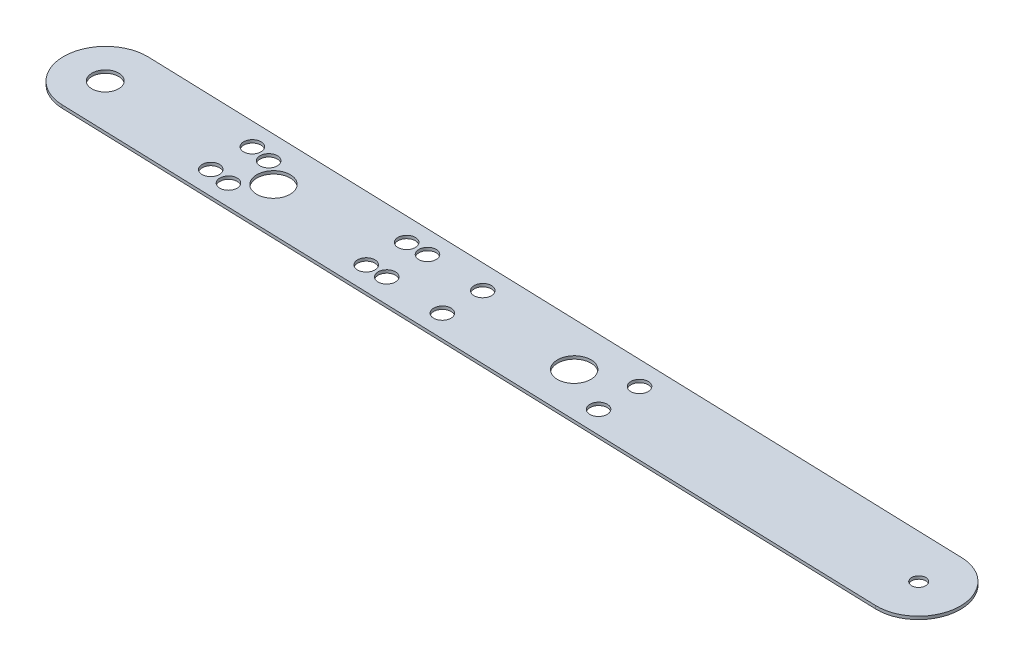
ISO-10303-21;
HEADER;
FILE_DESCRIPTION(('STEP AP214'),'2;1');
FILE_NAME('part.step','',(''),(''),'','','');
FILE_SCHEMA(('AUTOMOTIVE_DESIGN { 1 0 10303 214 1 1 1 1 }'));
ENDSEC;
DATA;
#1=APPLICATION_CONTEXT('core data for automotive mechanical design processes');
#2=APPLICATION_PROTOCOL_DEFINITION('international standard','automotive_design',2000,#1);
#3=PRODUCT_CONTEXT('',#1,'mechanical');
#4=PRODUCT('Part','Part','',(#3));
#5=PRODUCT_RELATED_PRODUCT_CATEGORY('part','',(#4));
#6=PRODUCT_DEFINITION_FORMATION('','',#4);
#7=PRODUCT_DEFINITION_CONTEXT('part definition',#1,'design');
#8=PRODUCT_DEFINITION('design','',#6,#7);
#9=PRODUCT_DEFINITION_SHAPE('','',#8);
#10=(LENGTH_UNIT() NAMED_UNIT(*) SI_UNIT(.MILLI.,.METRE.));
#11=(NAMED_UNIT(*) PLANE_ANGLE_UNIT() SI_UNIT($,.RADIAN.));
#12=(NAMED_UNIT(*) SI_UNIT($,.STERADIAN.) SOLID_ANGLE_UNIT());
#13=UNCERTAINTY_MEASURE_WITH_UNIT(LENGTH_MEASURE(1.E-05),#10,'distance_accuracy_value','');
#14=(GEOMETRIC_REPRESENTATION_CONTEXT(3) GLOBAL_UNCERTAINTY_ASSIGNED_CONTEXT((#13)) GLOBAL_UNIT_ASSIGNED_CONTEXT((#10,
#11,#12)) REPRESENTATION_CONTEXT('',''));
#15=CARTESIAN_POINT('',(0.,0.,0.));
#16=DIRECTION('',(0.,0.,1.));
#17=DIRECTION('',(1.,0.,0.));
#18=AXIS2_PLACEMENT_3D('',#15,#16,#17);
#19=CARTESIAN_POINT('',(-83.5473535217993,67.3199396217231,-4.14725625882662));
#20=DIRECTION('',(-0.00218494999367713,-0.999961923064164,-0.00844857475223902));
#21=DIRECTION('',(0.968147640378027,0.,-0.250380004054754));
#22=AXIS2_PLACEMENT_3D('',#19,#20,#21);
#23=CYLINDRICAL_SURFACE('',#22,12.5);
#24=CARTESIAN_POINT('',(-83.5493199767936,66.4199738909654,-4.15485997610363));
#25=DIRECTION('',(-0.00218494999367713,-0.999961923064164,-0.00844857475223902));
#26=DIRECTION('',(0.968147640378027,0.,-0.250380004054754));
#27=AXIS2_PLACEMENT_3D('',#24,#25,#26);
#28=CIRCLE('',#27,12.5);
#29=CARTESIAN_POINT('',(-83.9196687679673,66.315221983287,8.33921337131649));
#30=VERTEX_POINT('',#29);
#31=CARTESIAN_POINT('',(-83.1789711856199,66.5247257986437,-16.6489333235237));
#32=VERTEX_POINT('',#31);
#33=EDGE_CURVE('E105',#30,#32,#28,.T.);
#34=ORIENTED_EDGE('',*,*,#33,.F.);
#35=DIRECTION('',(-0.00218494999367713,-0.999961923064164,-0.00844857475223902));
#36=VECTOR('',#35,1.);
#37=CARTESIAN_POINT('',(-83.917702312973,67.2151877140447,8.3468170885935));
#38=LINE('',#37,#36);
#39=CARTESIAN_POINT('',(-83.917702312973,67.2151877140447,8.3468170885935));
#40=VERTEX_POINT('',#39);
#41=EDGE_CURVE('E11',#40,#30,#38,.T.);
#42=ORIENTED_EDGE('',*,*,#41,.F.);
#43=CARTESIAN_POINT('',(-83.5473535217993,67.3199396217231,-4.14725625882662));
#44=DIRECTION('',(-0.00218494999367713,-0.999961923064164,-0.00844857475223902));
#45=DIRECTION('',(0.968147640378027,0.,-0.250380004054754));
#46=AXIS2_PLACEMENT_3D('',#43,#44,#45);
#47=CIRCLE('',#46,12.5);
#48=CARTESIAN_POINT('',(-83.1770047306256,67.4246915294015,-16.6413296062467));
#49=VERTEX_POINT('',#48);
#50=EDGE_CURVE('E98',#40,#49,#47,.T.);
#51=ORIENTED_EDGE('',*,*,#50,.T.);
#52=DIRECTION('',(-0.00218494999367713,-0.999961923064164,-0.00844857475223902));
#53=VECTOR('',#52,1.);
#54=CARTESIAN_POINT('',(-83.1770047306256,67.4246915294015,-16.6413296062467));
#55=LINE('',#54,#53);
#56=EDGE_CURVE('E81',#49,#32,#55,.T.);
#57=ORIENTED_EDGE('',*,*,#56,.T.);
#58=EDGE_LOOP('',(#34,#42,#51,#57));
#59=FACE_BOUND('',#58,.T.);
#60=ADVANCED_FACE('F38',(#59),#23,.T.);
#61=CARTESIAN_POINT('',(-83.917702312973,67.2151877140447,8.3468170885935));
#62=DIRECTION('',(-0.0296279032938956,-0.00838015261426961,0.99952586779361));
#63=DIRECTION('',(-0.999558609257073,0.00243422759424636,-0.0296084649397214));
#64=AXIS2_PLACEMENT_3D('',#61,#62,#63);
#65=PLANE('',#64);
#66=DIRECTION('',(-0.999558609257073,0.00243422759424636,-0.0296084649397214));
#67=VECTOR('',#66,1.);
#68=CARTESIAN_POINT('',(-83.9196687679673,66.315221983287,8.33921337131649));
#69=LINE('',#68,#67);
#70=CARTESIAN_POINT('',(165.969983546301,65.7066650847254,15.7413296062468));
#71=VERTEX_POINT('',#70);
#72=EDGE_CURVE('E100',#71,#30,#69,.T.);
#73=ORIENTED_EDGE('',*,*,#72,.F.);
#74=DIRECTION('',(-0.00218494999367713,-0.999961923064164,-0.00844857475223902));
#75=VECTOR('',#74,1.);
#76=CARTESIAN_POINT('',(165.971950001295,66.6066308154832,15.7489333235239));
#77=LINE('',#76,#75);
#78=CARTESIAN_POINT('',(165.971950001295,66.6066308154832,15.7489333235239));
#79=VERTEX_POINT('',#78);
#80=EDGE_CURVE('E47',#79,#71,#77,.T.);
#81=ORIENTED_EDGE('',*,*,#80,.F.);
#82=DIRECTION('',(-0.999558609257073,0.00243422759424636,-0.0296084649397214));
#83=VECTOR('',#82,1.);
#84=CARTESIAN_POINT('',(-83.917702312973,67.2151877140447,8.3468170885935));
#85=LINE('',#84,#83);
#86=EDGE_CURVE('E95',#79,#40,#85,.T.);
#87=ORIENTED_EDGE('',*,*,#86,.T.);
#88=ORIENTED_EDGE('',*,*,#41,.T.);
#89=EDGE_LOOP('',(#73,#81,#87,#88));
#90=FACE_BOUND('',#89,.T.);
#91=ADVANCED_FACE('F116',(#90),#65,.T.);
#92=CARTESIAN_POINT('',(166.342298792469,66.7113827231615,3.25485997610373));
#93=DIRECTION('',(-0.00218494999367713,-0.999961923064164,-0.00844857475223902));
#94=DIRECTION('',(0.968147640378027,0.,-0.250380004054754));
#95=AXIS2_PLACEMENT_3D('',#92,#93,#94);
#96=CYLINDRICAL_SURFACE('',#95,12.5);
#97=CARTESIAN_POINT('',(166.340332337474,65.8114169924038,3.24725625882672));
#98=DIRECTION('',(-0.00218494999367713,-0.999961923064164,-0.00844857475223902));
#99=DIRECTION('',(0.968147640378027,0.,-0.250380004054754));
#100=AXIS2_PLACEMENT_3D('',#97,#98,#99);
#101=CIRCLE('',#100,12.5);
#102=CARTESIAN_POINT('',(166.710681128648,65.9161689000821,-9.24681708859342));
#103=VERTEX_POINT('',#102);
#104=EDGE_CURVE('E89',#103,#71,#101,.T.);
#105=ORIENTED_EDGE('',*,*,#104,.F.);
#106=DIRECTION('',(-0.00218494999367713,-0.999961923064164,-0.00844857475223902));
#107=VECTOR('',#106,1.);
#108=CARTESIAN_POINT('',(166.712647583642,66.8161346308399,-9.23921337131641));
#109=LINE('',#108,#107);
#110=CARTESIAN_POINT('',(166.712647583642,66.8161346308399,-9.23921337131641));
#111=VERTEX_POINT('',#110);
#112=EDGE_CURVE('E84',#111,#103,#109,.T.);
#113=ORIENTED_EDGE('',*,*,#112,.F.);
#114=CARTESIAN_POINT('',(166.342298792469,66.7113827231615,3.25485997610373));
#115=DIRECTION('',(-0.00218494999367713,-0.999961923064164,-0.00844857475223902));
#116=DIRECTION('',(0.968147640378027,0.,-0.250380004054754));
#117=AXIS2_PLACEMENT_3D('',#114,#115,#116);
#118=CIRCLE('',#117,12.5);
#119=EDGE_CURVE('E87',#111,#79,#118,.T.);
#120=ORIENTED_EDGE('',*,*,#119,.T.);
#121=ORIENTED_EDGE('',*,*,#80,.T.);
#122=EDGE_LOOP('',(#105,#113,#120,#121));
#123=FACE_BOUND('',#122,.T.);
#124=ADVANCED_FACE('F86',(#123),#96,.T.);
#125=CARTESIAN_POINT('',(-83.1770047306256,67.4246915294015,-16.6413296062467));
#126=DIRECTION('',(0.0296279032938955,0.00838015261426961,-0.99952586779361));
#127=DIRECTION('',(0.999558609257073,-0.00243422759424636,0.0296084649397212));
#128=AXIS2_PLACEMENT_3D('',#125,#126,#127);
#129=PLANE('',#128);
#130=DIRECTION('',(0.999558609257072,-0.00243422759424636,0.0296084649397213));
#131=VECTOR('',#130,1.);
#132=CARTESIAN_POINT('',(-83.1789711856199,66.5247257986437,-16.6489333235237));
#133=LINE('',#132,#131);
#134=EDGE_CURVE('E108',#32,#103,#133,.T.);
#135=ORIENTED_EDGE('',*,*,#134,.F.);
#136=ORIENTED_EDGE('',*,*,#56,.F.);
#137=DIRECTION('',(0.999558609257072,-0.00243422759424636,0.0296084649397213));
#138=VECTOR('',#137,1.);
#139=CARTESIAN_POINT('',(-83.1770047306256,67.4246915294015,-16.6413296062467));
#140=LINE('',#139,#138);
#141=EDGE_CURVE('E94',#49,#111,#140,.T.);
#142=ORIENTED_EDGE('',*,*,#141,.T.);
#143=ORIENTED_EDGE('',*,*,#112,.T.);
#144=EDGE_LOOP('',(#135,#136,#142,#143));
#145=FACE_BOUND('',#144,.T.);
#146=ADVANCED_FACE('F97',(#145),#129,.T.);
#147=CARTESIAN_POINT('',(-83.5473535217993,67.3199396217231,-4.14725625882662));
#148=DIRECTION('',(-0.00218494999367713,-0.999961923064164,-0.00844857475223902));
#149=DIRECTION('',(0.968147640378027,0.,-0.250380004054754));
#150=AXIS2_PLACEMENT_3D('',#147,#148,#149);
#151=PLANE('',#150);
#152=CARTESIAN_POINT('',(2.579763218555,67.0613649713818,4.18330404248978));
#153=DIRECTION('',(-0.00218494999367713,-0.999961923064164,-0.00844857475223902));
#154=DIRECTION('',(0.,0.00844859491908651,-0.999964309985058));
#155=AXIS2_PLACEMENT_3D('',#152,#153,#154);
#156=CIRCLE('',#155,2.59079999999999);
#157=CARTESIAN_POINT('',(2.579763218555,67.0832535910981,1.5925965081805));
#158=VERTEX_POINT('',#157);
#159=EDGE_CURVE('E209',#158,#158,#156,.T.);
#160=ORIENTED_EDGE('',*,*,#159,.T.);
#161=EDGE_LOOP('',(#160));
#162=FACE_BOUND('',#161,.T.);
#163=CARTESIAN_POINT('',(2.90560641669383,67.1596742108995,-7.5367138540857));
#164=DIRECTION('',(-0.00218494999367713,-0.999961923064164,-0.00844857475223902));
#165=DIRECTION('',(0.,0.00844859491908651,-0.999964309985058));
#166=AXIS2_PLACEMENT_3D('',#163,#164,#165);
#167=CIRCLE('',#166,2.59079999999999);
#168=CARTESIAN_POINT('',(2.90560641669383,67.1815628306158,-10.127421388395));
#169=VERTEX_POINT('',#168);
#170=EDGE_CURVE('E213',#169,#169,#167,.T.);
#171=ORIENTED_EDGE('',*,*,#170,.T.);
#172=EDGE_LOOP('',(#171));
#173=FACE_BOUND('',#172,.T.);
#174=CARTESIAN_POINT('',(-45.1168315637428,67.1770661636749,2.82424495679169));
#175=DIRECTION('',(-0.00218494999367713,-0.999961923064164,-0.00844857475223902));
#176=DIRECTION('',(0.,0.00844859491908651,-0.999964309985058));
#177=AXIS2_PLACEMENT_3D('',#174,#175,#176);
#178=CIRCLE('',#177,2.59079999999999);
#179=CARTESIAN_POINT('',(-45.1168315637428,67.1989547833912,0.23353742248241));
#180=VERTEX_POINT('',#179);
#181=EDGE_CURVE('E41',#180,#180,#178,.T.);
#182=ORIENTED_EDGE('',*,*,#181,.T.);
#183=EDGE_LOOP('',(#182));
#184=FACE_BOUND('',#183,.T.);
#185=CARTESIAN_POINT('',(-44.6672801925734,67.27690916925,-9.1093005324401));
#186=DIRECTION('',(-0.00218494999367713,-0.999961923064164,-0.00844857475223902));
#187=DIRECTION('',(0.,0.00844859491908651,-0.999964309985058));
#188=AXIS2_PLACEMENT_3D('',#185,#186,#187);
#189=CIRCLE('',#188,2.59079999999999);
#190=CARTESIAN_POINT('',(-44.6672801925734,67.2987977889664,-11.7000080667494));
#191=VERTEX_POINT('',#190);
#192=EDGE_CURVE('E225',#191,#191,#189,.T.);
#193=ORIENTED_EDGE('',*,*,#192,.T.);
#194=EDGE_LOOP('',(#193));
#195=FACE_BOUND('',#194,.T.);
#196=CARTESIAN_POINT('',(8.72285792019582,67.0476664442556,4.21593094191166));
#197=DIRECTION('',(0.00218494999367713,0.999961923064164,0.00844857475223902));
#198=DIRECTION('',(-0.968147640378027,0.,0.250380004054754));
#199=AXIS2_PLACEMENT_3D('',#196,#197,#198);
#200=CIRCLE('',#199,2.59079999999999);
#201=CARTESIAN_POINT('',(6.21458101350444,67.0476664442556,4.86461545641672));
#202=VERTEX_POINT('',#201);
#203=EDGE_CURVE('E228',#202,#202,#200,.T.);
#204=ORIENTED_EDGE('',*,*,#203,.F.);
#205=EDGE_LOOP('',(#204));
#206=FACE_BOUND('',#205,.T.);
#207=CARTESIAN_POINT('',(9.10563303581372,67.1462375410338,-7.54980362212577));
#208=DIRECTION('',(0.00218494999367713,0.999961923064164,0.00844857475223902));
#209=DIRECTION('',(-0.968147640378027,0.,0.250380004054754));
#210=AXIS2_PLACEMENT_3D('',#207,#208,#209);
#211=CIRCLE('',#210,2.59079999999999);
#212=CARTESIAN_POINT('',(6.59735612912234,67.1462375410338,-6.90111910762071));
#213=VERTEX_POINT('',#212);
#214=EDGE_CURVE('E234',#213,#213,#211,.T.);
#215=ORIENTED_EDGE('',*,*,#214,.F.);
#216=EDGE_LOOP('',(#215));
#217=FACE_BOUND('',#216,.T.);
#218=CARTESIAN_POINT('',(26.6351623944842,67.0991390563689,-6.508734980913));
#219=DIRECTION('',(-0.00218494999367713,-0.999961923064164,-0.00844857475223902));
#220=DIRECTION('',(0.968147640378027,0.,-0.250380004054754));
#221=AXIS2_PLACEMENT_3D('',#218,#219,#220);
#222=CIRCLE('',#221,2.5908);
#223=CARTESIAN_POINT('',(29.1434393011756,67.0991390563689,-7.15741949541806));
#224=VERTEX_POINT('',#223);
#225=EDGE_CURVE('E243',#224,#224,#222,.T.);
#226=ORIENTED_EDGE('',*,*,#225,.T.);
#227=EDGE_LOOP('',(#226));
#228=FACE_BOUND('',#227,.T.);
#229=CARTESIAN_POINT('',(26.3163015913516,67.0006535443119,5.2303405257625));
#230=DIRECTION('',(-0.00218494999367713,-0.999961923064164,-0.00844857475223902));
#231=DIRECTION('',(0.968147640378027,0.,-0.250380004054754));
#232=AXIS2_PLACEMENT_3D('',#229,#230,#231);
#233=CIRCLE('',#232,2.5908);
#234=CARTESIAN_POINT('',(28.824578498043,67.0006535443119,4.58165601125745));
#235=VERTEX_POINT('',#234);
#236=EDGE_CURVE('E249',#235,#235,#233,.T.);
#237=ORIENTED_EDGE('',*,*,#236,.T.);
#238=EDGE_LOOP('',(#237));
#239=FACE_BOUND('',#238,.T.);
#240=CARTESIAN_POINT('',(74.6322557844799,66.9835331477638,-5.2386677681567));
#241=DIRECTION('',(-0.00218494999367713,-0.999961923064164,-0.00844857475223902));
#242=DIRECTION('',(0.968147640378027,0.,-0.250380004054754));
#243=AXIS2_PLACEMENT_3D('',#240,#241,#242);
#244=CIRCLE('',#243,2.5908);
#245=CARTESIAN_POINT('',(77.1405326911712,66.9835331477638,-5.88735228266176));
#246=VERTEX_POINT('',#245);
#247=EDGE_CURVE('E255',#246,#246,#244,.T.);
#248=ORIENTED_EDGE('',*,*,#247,.T.);
#249=EDGE_LOOP('',(#248));
#250=FACE_BOUND('',#249,.T.);
#251=CARTESIAN_POINT('',(74.3078024802357,66.8837019213581,6.66113099457622));
#252=DIRECTION('',(-0.00218494999367713,-0.999961923064164,-0.00844857475223902));
#253=DIRECTION('',(0.968147640378027,0.,-0.250380004054754));
#254=AXIS2_PLACEMENT_3D('',#251,#252,#253);
#255=CIRCLE('',#254,2.5908);
#256=CARTESIAN_POINT('',(76.8160793869271,66.8837019213581,6.01244648007116));
#257=VERTEX_POINT('',#256);
#258=EDGE_CURVE('E261',#257,#257,#255,.T.);
#259=ORIENTED_EDGE('',*,*,#258,.T.);
#260=EDGE_LOOP('',(#259));
#261=FACE_BOUND('',#260,.T.);
#262=CARTESIAN_POINT('',(-38.9758360964038,67.1562704428359,3.69742903936981));
#263=DIRECTION('',(0.00218494999367713,0.999961923064164,0.00844857475223902));
#264=DIRECTION('',(-0.968147640378027,0.,0.250380004054754));
#265=AXIS2_PLACEMENT_3D('',#262,#263,#264);
#266=CIRCLE('',#265,2.59079999999999);
#267=CARTESIAN_POINT('',(-41.4841130030952,67.1562704428359,4.34611355387486));
#268=VERTEX_POINT('',#267);
#269=EDGE_CURVE('E264',#268,#268,#266,.T.);
#270=ORIENTED_EDGE('',*,*,#269,.F.);
#271=EDGE_LOOP('',(#270));
#272=FACE_BOUND('',#271,.T.);
#273=CARTESIAN_POINT('',(-31.8701734232087,67.1940900551006,-2.61649862144303));
#274=DIRECTION('',(0.00218494999367713,0.999961923064164,0.00844857475223902));
#275=DIRECTION('',(-0.968147640378027,0.,0.250380004054754));
#276=AXIS2_PLACEMENT_3D('',#273,#274,#275);
#277=CIRCLE('',#276,5.);
#278=CARTESIAN_POINT('',(-36.7109116250988,67.1940900551006,-1.36459860116926));
#279=VERTEX_POINT('',#278);
#280=EDGE_CURVE('E270',#279,#279,#277,.T.);
#281=ORIENTED_EDGE('',*,*,#280,.F.);
#282=EDGE_LOOP('',(#281));
#283=FACE_BOUND('',#282,.T.);
#284=CARTESIAN_POINT('',(60.5083576805305,66.9691203860426,0.119895697046185));
#285=DIRECTION('',(0.00218494999367713,0.999961923064164,0.00844857475223902));
#286=DIRECTION('',(-0.968147640378027,0.,0.250380004054754));
#287=AXIS2_PLACEMENT_3D('',#284,#285,#286);
#288=CIRCLE('',#287,5.);
#289=CARTESIAN_POINT('',(55.6676194786404,66.9691203860426,1.37179571731996));
#290=VERTEX_POINT('',#289);
#291=EDGE_CURVE('E276',#290,#290,#288,.T.);
#292=ORIENTED_EDGE('',*,*,#291,.F.);
#293=EDGE_LOOP('',(#292));
#294=FACE_BOUND('',#293,.T.);
#295=CARTESIAN_POINT('',(166.342298792469,66.7113827231615,3.25485997610373));
#296=DIRECTION('',(-0.00218494999367713,-0.999961923064164,-0.00844857475223902));
#297=DIRECTION('',(0.968147640378027,0.,-0.250380004054754));
#298=AXIS2_PLACEMENT_3D('',#295,#296,#297);
#299=CIRCLE('',#298,2.1082);
#300=CARTESIAN_POINT('',(168.383347647914,66.7113827231615,2.7270088515555));
#301=VERTEX_POINT('',#300);
#302=EDGE_CURVE('E285',#301,#301,#299,.T.);
#303=ORIENTED_EDGE('',*,*,#302,.T.);
#304=EDGE_LOOP('',(#303));
#305=FACE_BOUND('',#304,.T.);
#306=CARTESIAN_POINT('',(-83.5473535217993,67.3199396217231,-4.14725625882663));
#307=DIRECTION('',(-0.00218494999367713,-0.999961923064164,-0.00844857475223902));
#308=DIRECTION('',(0.968147640378027,0.,-0.250380004054754));
#309=AXIS2_PLACEMENT_3D('',#306,#307,#308);
#310=CIRCLE('',#309,4.);
#311=CARTESIAN_POINT('',(-79.6747629602872,67.3199396217231,-5.14877627504564));
#312=VERTEX_POINT('',#311);
#313=EDGE_CURVE('E291',#312,#312,#310,.T.);
#314=ORIENTED_EDGE('',*,*,#313,.T.);
#315=EDGE_LOOP('',(#314));
#316=FACE_BOUND('',#315,.T.);
#317=CARTESIAN_POINT('',(-38.6406908127292,67.2540115647366,-7.95775290449861));
#318=DIRECTION('',(-0.00218494999367713,-0.999961923064164,-0.00844857475223902));
#319=DIRECTION('',(0.968147640378027,0.,-0.250380004054754));
#320=AXIS2_PLACEMENT_3D('',#317,#318,#319);
#321=CIRCLE('',#320,2.5908);
#322=CARTESIAN_POINT('',(-36.1324139060378,67.2540115647366,-8.60643741900367));
#323=VERTEX_POINT('',#322);
#324=EDGE_CURVE('E109',#323,#323,#321,.T.);
#325=ORIENTED_EDGE('',*,*,#324,.T.);
#326=EDGE_LOOP('',(#325));
#327=FACE_BOUND('',#326,.T.);
#328=ORIENTED_EDGE('',*,*,#50,.F.);
#329=ORIENTED_EDGE('',*,*,#86,.F.);
#330=ORIENTED_EDGE('',*,*,#119,.F.);
#331=ORIENTED_EDGE('',*,*,#141,.F.);
#332=EDGE_LOOP('',(#328,#329,#330,#331));
#333=FACE_BOUND('',#332,.T.);
#334=ADVANCED_FACE('F93',(#162,#173,#184,#195,#206,#217,#228,#239,#250,#261,#272,#283,#294,#305,
#316,#327,#333),#151,.F.);
#335=CARTESIAN_POINT('',(-83.5493199767936,66.4199738909654,-4.15485997610363));
#336=DIRECTION('',(-0.00218494999367713,-0.999961923064164,-0.00844857475223902));
#337=DIRECTION('',(0.968147640378027,0.,-0.250380004054754));
#338=AXIS2_PLACEMENT_3D('',#335,#336,#337);
#339=PLANE('',#338);
#340=CARTESIAN_POINT('',(2.57779676356069,66.161399240624,4.17570032521277));
#341=DIRECTION('',(-0.00218494999367713,-0.999961923064164,-0.00844857475223902));
#342=DIRECTION('',(0.,0.00844859491908651,-0.999964309985058));
#343=AXIS2_PLACEMENT_3D('',#340,#341,#342);
#344=CIRCLE('',#343,2.59079999999999);
#345=CARTESIAN_POINT('',(2.57779676356069,66.1832878603404,1.58499279090349));
#346=VERTEX_POINT('',#345);
#347=EDGE_CURVE('E207',#346,#346,#344,.T.);
#348=ORIENTED_EDGE('',*,*,#347,.F.);
#349=EDGE_LOOP('',(#348));
#350=FACE_BOUND('',#349,.T.);
#351=CARTESIAN_POINT('',(2.90363996169952,66.2597084801417,-7.54431757136272));
#352=DIRECTION('',(-0.00218494999367713,-0.999961923064164,-0.00844857475223902));
#353=DIRECTION('',(0.,0.00844859491908651,-0.999964309985058));
#354=AXIS2_PLACEMENT_3D('',#351,#352,#353);
#355=CIRCLE('',#354,2.59079999999999);
#356=CARTESIAN_POINT('',(2.90363996169952,66.2815970998581,-10.135025105672));
#357=VERTEX_POINT('',#356);
#358=EDGE_CURVE('E210',#357,#357,#355,.T.);
#359=ORIENTED_EDGE('',*,*,#358,.F.);
#360=EDGE_LOOP('',(#359));
#361=FACE_BOUND('',#360,.T.);
#362=CARTESIAN_POINT('',(-45.1187980187371,66.2771004329172,2.81664123951468));
#363=DIRECTION('',(-0.00218494999367713,-0.999961923064164,-0.00844857475223902));
#364=DIRECTION('',(0.,0.00844859491908651,-0.999964309985058));
#365=AXIS2_PLACEMENT_3D('',#362,#363,#364);
#366=CIRCLE('',#365,2.59079999999999);
#367=CARTESIAN_POINT('',(-45.1187980187371,66.2989890526335,0.225933705205403));
#368=VERTEX_POINT('',#367);
#369=EDGE_CURVE('E219',#368,#368,#366,.T.);
#370=ORIENTED_EDGE('',*,*,#369,.F.);
#371=EDGE_LOOP('',(#370));
#372=FACE_BOUND('',#371,.T.);
#373=CARTESIAN_POINT('',(-44.6692466475677,66.3769434384923,-9.11690424971712));
#374=DIRECTION('',(-0.00218494999367713,-0.999961923064164,-0.00844857475223902));
#375=DIRECTION('',(0.,0.00844859491908651,-0.999964309985058));
#376=AXIS2_PLACEMENT_3D('',#373,#374,#375);
#377=CIRCLE('',#376,2.59079999999999);
#378=CARTESIAN_POINT('',(-44.6692466475677,66.3988320582087,-11.7076117840264));
#379=VERTEX_POINT('',#378);
#380=EDGE_CURVE('E222',#379,#379,#377,.T.);
#381=ORIENTED_EDGE('',*,*,#380,.F.);
#382=EDGE_LOOP('',(#381));
#383=FACE_BOUND('',#382,.T.);
#384=CARTESIAN_POINT('',(8.72089146520151,66.1477007134979,4.20832722463465));
#385=DIRECTION('',(0.00218494999367713,0.999961923064164,0.00844857475223902));
#386=DIRECTION('',(-0.968147640378027,0.,0.250380004054754));
#387=AXIS2_PLACEMENT_3D('',#384,#385,#386);
#388=CIRCLE('',#387,2.5908);
#389=CARTESIAN_POINT('',(6.21261455851012,66.1477007134979,4.85701173913971));
#390=VERTEX_POINT('',#389);
#391=EDGE_CURVE('E231',#390,#390,#388,.T.);
#392=ORIENTED_EDGE('',*,*,#391,.T.);
#393=EDGE_LOOP('',(#392));
#394=FACE_BOUND('',#393,.T.);
#395=CARTESIAN_POINT('',(9.10366658081941,66.246271810276,-7.55740733940278));
#396=DIRECTION('',(0.00218494999367713,0.999961923064164,0.00844857475223902));
#397=DIRECTION('',(-0.968147640378027,0.,0.250380004054754));
#398=AXIS2_PLACEMENT_3D('',#395,#396,#397);
#399=CIRCLE('',#398,2.5908);
#400=CARTESIAN_POINT('',(6.59538967412802,66.246271810276,-6.90872282489772));
#401=VERTEX_POINT('',#400);
#402=EDGE_CURVE('E237',#401,#401,#399,.T.);
#403=ORIENTED_EDGE('',*,*,#402,.T.);
#404=EDGE_LOOP('',(#403));
#405=FACE_BOUND('',#404,.T.);
#406=CARTESIAN_POINT('',(26.6331959394899,66.1991733256112,-6.51633869819002));
#407=DIRECTION('',(-0.00218494999367713,-0.999961923064164,-0.00844857475223902));
#408=DIRECTION('',(0.968147640378027,0.,-0.250380004054754));
#409=AXIS2_PLACEMENT_3D('',#406,#407,#408);
#410=CIRCLE('',#409,2.5908);
#411=CARTESIAN_POINT('',(29.1414728461813,66.1991733256112,-7.16502321269508));
#412=VERTEX_POINT('',#411);
#413=EDGE_CURVE('E240',#412,#412,#410,.T.);
#414=ORIENTED_EDGE('',*,*,#413,.F.);
#415=EDGE_LOOP('',(#414));
#416=FACE_BOUND('',#415,.T.);
#417=CARTESIAN_POINT('',(26.3143351363573,66.1006878135541,5.22273680848549));
#418=DIRECTION('',(-0.00218494999367713,-0.999961923064164,-0.00844857475223902));
#419=DIRECTION('',(0.968147640378027,0.,-0.250380004054754));
#420=AXIS2_PLACEMENT_3D('',#417,#418,#419);
#421=CIRCLE('',#420,2.5908);
#422=CARTESIAN_POINT('',(28.8226120430487,66.1006878135541,4.57405229398043));
#423=VERTEX_POINT('',#422);
#424=EDGE_CURVE('E246',#423,#423,#421,.T.);
#425=ORIENTED_EDGE('',*,*,#424,.F.);
#426=EDGE_LOOP('',(#425));
#427=FACE_BOUND('',#426,.T.);
#428=CARTESIAN_POINT('',(74.6302893294855,66.0835674170061,-5.24627148543371));
#429=DIRECTION('',(-0.00218494999367713,-0.999961923064164,-0.00844857475223902));
#430=DIRECTION('',(0.968147640378027,0.,-0.250380004054754));
#431=AXIS2_PLACEMENT_3D('',#428,#429,#430);
#432=CIRCLE('',#431,2.5908);
#433=CARTESIAN_POINT('',(77.1385662361769,66.0835674170061,-5.89495599993877));
#434=VERTEX_POINT('',#433);
#435=EDGE_CURVE('E252',#434,#434,#432,.T.);
#436=ORIENTED_EDGE('',*,*,#435,.F.);
#437=EDGE_LOOP('',(#436));
#438=FACE_BOUND('',#437,.T.);
#439=CARTESIAN_POINT('',(74.3058360252414,65.9837361906004,6.65352727729921));
#440=DIRECTION('',(-0.00218494999367713,-0.999961923064164,-0.00844857475223902));
#441=DIRECTION('',(0.968147640378027,0.,-0.250380004054754));
#442=AXIS2_PLACEMENT_3D('',#439,#440,#441);
#443=CIRCLE('',#442,2.5908);
#444=CARTESIAN_POINT('',(76.8141129319328,65.9837361906004,6.00484276279415));
#445=VERTEX_POINT('',#444);
#446=EDGE_CURVE('E258',#445,#445,#443,.T.);
#447=ORIENTED_EDGE('',*,*,#446,.F.);
#448=EDGE_LOOP('',(#447));
#449=FACE_BOUND('',#448,.T.);
#450=CARTESIAN_POINT('',(-38.9778025513981,66.2563047120781,3.68982532209279));
#451=DIRECTION('',(0.00218494999367713,0.999961923064164,0.00844857475223902));
#452=DIRECTION('',(-0.968147640378027,0.,0.250380004054754));
#453=AXIS2_PLACEMENT_3D('',#450,#451,#452);
#454=CIRCLE('',#453,2.5908);
#455=CARTESIAN_POINT('',(-41.4860794580895,66.2563047120781,4.33850983659785));
#456=VERTEX_POINT('',#455);
#457=EDGE_CURVE('E267',#456,#456,#454,.T.);
#458=ORIENTED_EDGE('',*,*,#457,.T.);
#459=EDGE_LOOP('',(#458));
#460=FACE_BOUND('',#459,.T.);
#461=CARTESIAN_POINT('',(-31.872139878203,66.2941243243428,-2.62410233872004));
#462=DIRECTION('',(0.00218494999367713,0.999961923064164,0.00844857475223902));
#463=DIRECTION('',(-0.968147640378027,0.,0.250380004054754));
#464=AXIS2_PLACEMENT_3D('',#461,#462,#463);
#465=CIRCLE('',#464,5.);
#466=CARTESIAN_POINT('',(-36.7128780800931,66.2941243243428,-1.37220231844627));
#467=VERTEX_POINT('',#466);
#468=EDGE_CURVE('E273',#467,#467,#465,.T.);
#469=ORIENTED_EDGE('',*,*,#468,.T.);
#470=EDGE_LOOP('',(#469));
#471=FACE_BOUND('',#470,.T.);
#472=CARTESIAN_POINT('',(60.5063912255362,66.0691546552848,0.112291979769174));
#473=DIRECTION('',(0.00218494999367713,0.999961923064164,0.00844857475223902));
#474=DIRECTION('',(-0.968147640378027,0.,0.250380004054754));
#475=AXIS2_PLACEMENT_3D('',#472,#473,#474);
#476=CIRCLE('',#475,5.);
#477=CARTESIAN_POINT('',(55.665653023646,66.0691546552848,1.36419200004295));
#478=VERTEX_POINT('',#477);
#479=EDGE_CURVE('E279',#478,#478,#476,.T.);
#480=ORIENTED_EDGE('',*,*,#479,.T.);
#481=EDGE_LOOP('',(#480));
#482=FACE_BOUND('',#481,.T.);
#483=CARTESIAN_POINT('',(166.340332337474,65.8114169924038,3.24725625882672));
#484=DIRECTION('',(-0.00218494999367713,-0.999961923064164,-0.00844857475223902));
#485=DIRECTION('',(0.968147640378027,0.,-0.250380004054754));
#486=AXIS2_PLACEMENT_3D('',#483,#484,#485);
#487=CIRCLE('',#486,2.1082);
#488=CARTESIAN_POINT('',(168.381381192919,65.8114169924038,2.71940513427848));
#489=VERTEX_POINT('',#488);
#490=EDGE_CURVE('E282',#489,#489,#487,.T.);
#491=ORIENTED_EDGE('',*,*,#490,.F.);
#492=EDGE_LOOP('',(#491));
#493=FACE_BOUND('',#492,.T.);
#494=CARTESIAN_POINT('',(-83.5493199767936,66.4199738909654,-4.15485997610364));
#495=DIRECTION('',(-0.00218494999367713,-0.999961923064164,-0.00844857475223902));
#496=DIRECTION('',(0.968147640378027,0.,-0.250380004054754));
#497=AXIS2_PLACEMENT_3D('',#494,#495,#496);
#498=CIRCLE('',#497,4.);
#499=CARTESIAN_POINT('',(-79.6767294152815,66.4199738909654,-5.15637999232266));
#500=VERTEX_POINT('',#499);
#501=EDGE_CURVE('E288',#500,#500,#498,.T.);
#502=ORIENTED_EDGE('',*,*,#501,.F.);
#503=EDGE_LOOP('',(#502));
#504=FACE_BOUND('',#503,.T.);
#505=CARTESIAN_POINT('',(-38.6426572677235,66.3540458339788,-7.96535662177562));
#506=DIRECTION('',(-0.00218494999367713,-0.999961923064164,-0.00844857475223902));
#507=DIRECTION('',(0.968147640378027,0.,-0.250380004054754));
#508=AXIS2_PLACEMENT_3D('',#505,#506,#507);
#509=CIRCLE('',#508,2.59079999999999);
#510=CARTESIAN_POINT('',(-36.1343803610321,66.3540458339788,-8.61404113628067));
#511=VERTEX_POINT('',#510);
#512=EDGE_CURVE('E294',#511,#511,#509,.T.);
#513=ORIENTED_EDGE('',*,*,#512,.F.);
#514=EDGE_LOOP('',(#513));
#515=FACE_BOUND('',#514,.T.);
#516=ORIENTED_EDGE('',*,*,#33,.T.);
#517=ORIENTED_EDGE('',*,*,#134,.T.);
#518=ORIENTED_EDGE('',*,*,#104,.T.);
#519=ORIENTED_EDGE('',*,*,#72,.T.);
#520=EDGE_LOOP('',(#516,#517,#518,#519));
#521=FACE_BOUND('',#520,.T.);
#522=ADVANCED_FACE('F115',(#350,#361,#372,#383,#394,#405,#416,#427,#438,#449,#460,#471,#482,
#493,#504,#515,#521),#339,.T.);
#523=CARTESIAN_POINT('',(-38.6426572677235,66.3540458339788,-7.96535662177562));
#524=DIRECTION('',(-0.00218494999367713,-0.999961923064164,-0.00844857475223902));
#525=DIRECTION('',(0.968147640378027,0.,-0.250380004054754));
#526=AXIS2_PLACEMENT_3D('',#523,#524,#525);
#527=CYLINDRICAL_SURFACE('',#526,2.59079999999999);
#528=ORIENTED_EDGE('',*,*,#324,.F.);
#529=EDGE_LOOP('',(#528));
#530=FACE_BOUND('',#529,.T.);
#531=ORIENTED_EDGE('',*,*,#512,.T.);
#532=EDGE_LOOP('',(#531));
#533=FACE_BOUND('',#532,.T.);
#534=ADVANCED_FACE('F135',(#530,#533),#527,.F.);
#535=CARTESIAN_POINT('',(-83.5493199767936,66.4199738909654,-4.15485997610364));
#536=DIRECTION('',(-0.00218494999367713,-0.999961923064164,-0.00844857475223902));
#537=DIRECTION('',(0.968147640378027,0.,-0.250380004054754));
#538=AXIS2_PLACEMENT_3D('',#535,#536,#537);
#539=CYLINDRICAL_SURFACE('',#538,4.);
#540=ORIENTED_EDGE('',*,*,#313,.F.);
#541=EDGE_LOOP('',(#540));
#542=FACE_BOUND('',#541,.T.);
#543=ORIENTED_EDGE('',*,*,#501,.T.);
#544=EDGE_LOOP('',(#543));
#545=FACE_BOUND('',#544,.T.);
#546=ADVANCED_FACE('F142',(#542,#545),#539,.F.);
#547=CARTESIAN_POINT('',(166.340332337474,65.8114169924038,3.24725625882672));
#548=DIRECTION('',(-0.00218494999367713,-0.999961923064164,-0.00844857475223902));
#549=DIRECTION('',(0.968147640378027,0.,-0.250380004054754));
#550=AXIS2_PLACEMENT_3D('',#547,#548,#549);
#551=CYLINDRICAL_SURFACE('',#550,2.1082);
#552=ORIENTED_EDGE('',*,*,#302,.F.);
#553=EDGE_LOOP('',(#552));
#554=FACE_BOUND('',#553,.T.);
#555=ORIENTED_EDGE('',*,*,#490,.T.);
#556=EDGE_LOOP('',(#555));
#557=FACE_BOUND('',#556,.T.);
#558=ADVANCED_FACE('F146',(#554,#557),#551,.F.);
#559=CARTESIAN_POINT('',(60.5083576805305,66.9691203860426,0.119895697046185));
#560=DIRECTION('',(0.00218494999367713,0.999961923064164,0.00844857475223902));
#561=DIRECTION('',(-0.968147640378027,0.,0.250380004054754));
#562=AXIS2_PLACEMENT_3D('',#559,#560,#561);
#563=CYLINDRICAL_SURFACE('',#562,5.);
#564=ORIENTED_EDGE('',*,*,#479,.F.);
#565=EDGE_LOOP('',(#564));
#566=FACE_BOUND('',#565,.T.);
#567=ORIENTED_EDGE('',*,*,#291,.T.);
#568=EDGE_LOOP('',(#567));
#569=FACE_BOUND('',#568,.T.);
#570=ADVANCED_FACE('F150',(#566,#569),#563,.F.);
#571=CARTESIAN_POINT('',(-31.8701734232087,67.1940900551006,-2.61649862144303));
#572=DIRECTION('',(0.00218494999367713,0.999961923064164,0.00844857475223902));
#573=DIRECTION('',(-0.968147640378027,0.,0.250380004054754));
#574=AXIS2_PLACEMENT_3D('',#571,#572,#573);
#575=CYLINDRICAL_SURFACE('',#574,5.);
#576=ORIENTED_EDGE('',*,*,#468,.F.);
#577=EDGE_LOOP('',(#576));
#578=FACE_BOUND('',#577,.T.);
#579=ORIENTED_EDGE('',*,*,#280,.T.);
#580=EDGE_LOOP('',(#579));
#581=FACE_BOUND('',#580,.T.);
#582=ADVANCED_FACE('F154',(#578,#581),#575,.F.);
#583=CARTESIAN_POINT('',(-38.9758360964038,67.1562704428359,3.69742903936981));
#584=DIRECTION('',(0.00218494999367713,0.999961923064164,0.00844857475223902));
#585=DIRECTION('',(-0.968147640378027,0.,0.250380004054754));
#586=AXIS2_PLACEMENT_3D('',#583,#584,#585);
#587=CYLINDRICAL_SURFACE('',#586,2.59079999999999);
#588=ORIENTED_EDGE('',*,*,#457,.F.);
#589=EDGE_LOOP('',(#588));
#590=FACE_BOUND('',#589,.T.);
#591=ORIENTED_EDGE('',*,*,#269,.T.);
#592=EDGE_LOOP('',(#591));
#593=FACE_BOUND('',#592,.T.);
#594=ADVANCED_FACE('F158',(#590,#593),#587,.F.);
#595=CARTESIAN_POINT('',(74.3058360252414,65.9837361906004,6.65352727729921));
#596=DIRECTION('',(-0.00218494999367713,-0.999961923064164,-0.00844857475223902));
#597=DIRECTION('',(0.968147640378027,0.,-0.250380004054754));
#598=AXIS2_PLACEMENT_3D('',#595,#596,#597);
#599=CYLINDRICAL_SURFACE('',#598,2.5908);
#600=ORIENTED_EDGE('',*,*,#258,.F.);
#601=EDGE_LOOP('',(#600));
#602=FACE_BOUND('',#601,.T.);
#603=ORIENTED_EDGE('',*,*,#446,.T.);
#604=EDGE_LOOP('',(#603));
#605=FACE_BOUND('',#604,.T.);
#606=ADVANCED_FACE('F162',(#602,#605),#599,.F.);
#607=CARTESIAN_POINT('',(74.6302893294855,66.0835674170061,-5.24627148543371));
#608=DIRECTION('',(-0.00218494999367713,-0.999961923064164,-0.00844857475223902));
#609=DIRECTION('',(0.968147640378027,0.,-0.250380004054754));
#610=AXIS2_PLACEMENT_3D('',#607,#608,#609);
#611=CYLINDRICAL_SURFACE('',#610,2.5908);
#612=ORIENTED_EDGE('',*,*,#247,.F.);
#613=EDGE_LOOP('',(#612));
#614=FACE_BOUND('',#613,.T.);
#615=ORIENTED_EDGE('',*,*,#435,.T.);
#616=EDGE_LOOP('',(#615));
#617=FACE_BOUND('',#616,.T.);
#618=ADVANCED_FACE('F166',(#614,#617),#611,.F.);
#619=CARTESIAN_POINT('',(26.3143351363573,66.1006878135541,5.22273680848549));
#620=DIRECTION('',(-0.00218494999367713,-0.999961923064164,-0.00844857475223902));
#621=DIRECTION('',(0.968147640378027,0.,-0.250380004054754));
#622=AXIS2_PLACEMENT_3D('',#619,#620,#621);
#623=CYLINDRICAL_SURFACE('',#622,2.5908);
#624=ORIENTED_EDGE('',*,*,#236,.F.);
#625=EDGE_LOOP('',(#624));
#626=FACE_BOUND('',#625,.T.);
#627=ORIENTED_EDGE('',*,*,#424,.T.);
#628=EDGE_LOOP('',(#627));
#629=FACE_BOUND('',#628,.T.);
#630=ADVANCED_FACE('F170',(#626,#629),#623,.F.);
#631=CARTESIAN_POINT('',(26.6331959394899,66.1991733256112,-6.51633869819002));
#632=DIRECTION('',(-0.00218494999367713,-0.999961923064164,-0.00844857475223902));
#633=DIRECTION('',(0.968147640378027,0.,-0.250380004054754));
#634=AXIS2_PLACEMENT_3D('',#631,#632,#633);
#635=CYLINDRICAL_SURFACE('',#634,2.5908);
#636=ORIENTED_EDGE('',*,*,#225,.F.);
#637=EDGE_LOOP('',(#636));
#638=FACE_BOUND('',#637,.T.);
#639=ORIENTED_EDGE('',*,*,#413,.T.);
#640=EDGE_LOOP('',(#639));
#641=FACE_BOUND('',#640,.T.);
#642=ADVANCED_FACE('F174',(#638,#641),#635,.F.);
#643=CARTESIAN_POINT('',(9.10563303581372,67.1462375410338,-7.54980362212577));
#644=DIRECTION('',(0.00218494999367713,0.999961923064164,0.00844857475223902));
#645=DIRECTION('',(-0.968147640378027,0.,0.250380004054754));
#646=AXIS2_PLACEMENT_3D('',#643,#644,#645);
#647=CYLINDRICAL_SURFACE('',#646,2.59079999999999);
#648=ORIENTED_EDGE('',*,*,#402,.F.);
#649=EDGE_LOOP('',(#648));
#650=FACE_BOUND('',#649,.T.);
#651=ORIENTED_EDGE('',*,*,#214,.T.);
#652=EDGE_LOOP('',(#651));
#653=FACE_BOUND('',#652,.T.);
#654=ADVANCED_FACE('F178',(#650,#653),#647,.F.);
#655=CARTESIAN_POINT('',(8.72285792019582,67.0476664442556,4.21593094191166));
#656=DIRECTION('',(0.00218494999367713,0.999961923064164,0.00844857475223902));
#657=DIRECTION('',(-0.968147640378027,0.,0.250380004054754));
#658=AXIS2_PLACEMENT_3D('',#655,#656,#657);
#659=CYLINDRICAL_SURFACE('',#658,2.59079999999999);
#660=ORIENTED_EDGE('',*,*,#391,.F.);
#661=EDGE_LOOP('',(#660));
#662=FACE_BOUND('',#661,.T.);
#663=ORIENTED_EDGE('',*,*,#203,.T.);
#664=EDGE_LOOP('',(#663));
#665=FACE_BOUND('',#664,.T.);
#666=ADVANCED_FACE('F182',(#662,#665),#659,.F.);
#667=CARTESIAN_POINT('',(-44.6692466475677,66.3769434384923,-9.11690424971712));
#668=DIRECTION('',(-0.00218494999367713,-0.999961923064164,-0.00844857475223902));
#669=DIRECTION('',(0.,0.00844859491908651,-0.999964309985058));
#670=AXIS2_PLACEMENT_3D('',#667,#668,#669);
#671=CYLINDRICAL_SURFACE('',#670,2.59079999999999);
#672=ORIENTED_EDGE('',*,*,#380,.T.);
#673=EDGE_LOOP('',(#672));
#674=FACE_BOUND('',#673,.T.);
#675=ORIENTED_EDGE('',*,*,#192,.F.);
#676=EDGE_LOOP('',(#675));
#677=FACE_BOUND('',#676,.T.);
#678=ADVANCED_FACE('F186',(#674,#677),#671,.F.);
#679=CARTESIAN_POINT('',(-45.1187980187371,66.2771004329172,2.81664123951468));
#680=DIRECTION('',(-0.00218494999367713,-0.999961923064164,-0.00844857475223902));
#681=DIRECTION('',(0.,0.00844859491908651,-0.999964309985058));
#682=AXIS2_PLACEMENT_3D('',#679,#680,#681);
#683=CYLINDRICAL_SURFACE('',#682,2.59079999999999);
#684=ORIENTED_EDGE('',*,*,#369,.T.);
#685=EDGE_LOOP('',(#684));
#686=FACE_BOUND('',#685,.T.);
#687=ORIENTED_EDGE('',*,*,#181,.F.);
#688=EDGE_LOOP('',(#687));
#689=FACE_BOUND('',#688,.T.);
#690=ADVANCED_FACE('F190',(#686,#689),#683,.F.);
#691=CARTESIAN_POINT('',(2.90363996169952,66.2597084801417,-7.54431757136272));
#692=DIRECTION('',(-0.00218494999367713,-0.999961923064164,-0.00844857475223902));
#693=DIRECTION('',(0.,0.00844859491908651,-0.999964309985058));
#694=AXIS2_PLACEMENT_3D('',#691,#692,#693);
#695=CYLINDRICAL_SURFACE('',#694,2.59079999999999);
#696=ORIENTED_EDGE('',*,*,#358,.T.);
#697=EDGE_LOOP('',(#696));
#698=FACE_BOUND('',#697,.T.);
#699=ORIENTED_EDGE('',*,*,#170,.F.);
#700=EDGE_LOOP('',(#699));
#701=FACE_BOUND('',#700,.T.);
#702=ADVANCED_FACE('F194',(#698,#701),#695,.F.);
#703=CARTESIAN_POINT('',(2.57779676356069,66.161399240624,4.17570032521277));
#704=DIRECTION('',(-0.00218494999367713,-0.999961923064164,-0.00844857475223902));
#705=DIRECTION('',(0.,0.00844859491908651,-0.999964309985058));
#706=AXIS2_PLACEMENT_3D('',#703,#704,#705);
#707=CYLINDRICAL_SURFACE('',#706,2.59079999999999);
#708=ORIENTED_EDGE('',*,*,#347,.T.);
#709=EDGE_LOOP('',(#708));
#710=FACE_BOUND('',#709,.T.);
#711=ORIENTED_EDGE('',*,*,#159,.F.);
#712=EDGE_LOOP('',(#711));
#713=FACE_BOUND('',#712,.T.);
#714=ADVANCED_FACE('F198',(#710,#713),#707,.F.);
#715=CLOSED_SHELL('',(#60,#91,#124,#146,#334,#522,#534,#546,#558,#570,#582,#594,#606,#618,#630,
#642,#654,#666,#678,#690,#702,#714));
#716=MANIFOLD_SOLID_BREP('B2',#715);
#717=ADVANCED_BREP_SHAPE_REPRESENTATION('',(#18,#716),#14);
#718=SHAPE_DEFINITION_REPRESENTATION(#9,#717);
ENDSEC;
END-ISO-10303-21;
